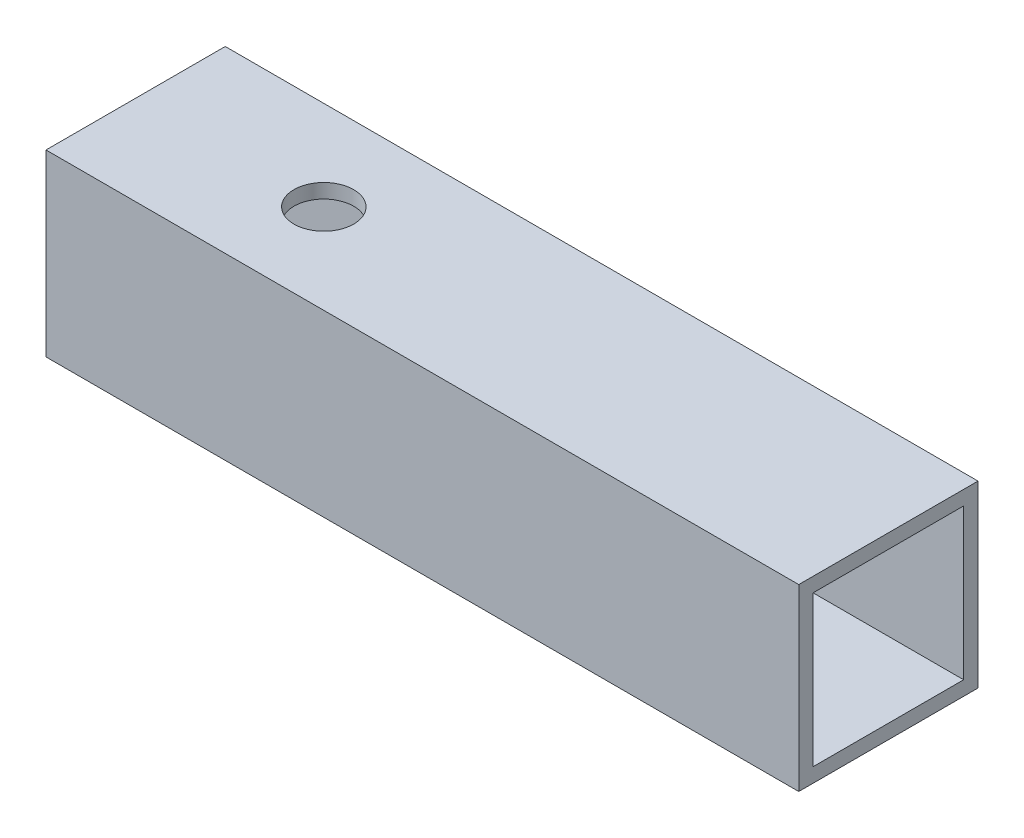
ISO-10303-21;
HEADER;
FILE_DESCRIPTION(('STEP AP214'),'2;1');
FILE_NAME('part.step','',(''),(''),'','','');
FILE_SCHEMA(('AUTOMOTIVE_DESIGN { 1 0 10303 214 1 1 1 1 }'));
ENDSEC;
DATA;
#1=APPLICATION_CONTEXT('core data for automotive mechanical design processes');
#2=APPLICATION_PROTOCOL_DEFINITION('international standard','automotive_design',2000,#1);
#3=PRODUCT_CONTEXT('',#1,'mechanical');
#4=PRODUCT('Part','Part','',(#3));
#5=PRODUCT_RELATED_PRODUCT_CATEGORY('part','',(#4));
#6=PRODUCT_DEFINITION_FORMATION('','',#4);
#7=PRODUCT_DEFINITION_CONTEXT('part definition',#1,'design');
#8=PRODUCT_DEFINITION('design','',#6,#7);
#9=PRODUCT_DEFINITION_SHAPE('','',#8);
#10=(LENGTH_UNIT() NAMED_UNIT(*) SI_UNIT(.MILLI.,.METRE.));
#11=(NAMED_UNIT(*) PLANE_ANGLE_UNIT() SI_UNIT($,.RADIAN.));
#12=(NAMED_UNIT(*) SI_UNIT($,.STERADIAN.) SOLID_ANGLE_UNIT());
#13=UNCERTAINTY_MEASURE_WITH_UNIT(LENGTH_MEASURE(1.E-05),#10,'distance_accuracy_value','');
#14=(GEOMETRIC_REPRESENTATION_CONTEXT(3) GLOBAL_UNCERTAINTY_ASSIGNED_CONTEXT((#13)) GLOBAL_UNIT_ASSIGNED_CONTEXT((#10,
#11,#12)) REPRESENTATION_CONTEXT('',''));
#15=CARTESIAN_POINT('',(0.,0.,0.));
#16=DIRECTION('',(0.,0.,1.));
#17=DIRECTION('',(1.,0.,0.));
#18=AXIS2_PLACEMENT_3D('',#15,#16,#17);
#19=CARTESIAN_POINT('',(20.,2.38125,-2.38125));
#20=DIRECTION('',(0.,0.,1.));
#21=DIRECTION('',(0.,-1.,0.));
#22=AXIS2_PLACEMENT_3D('',#19,#20,#21);
#23=PLANE('',#22);
#24=DIRECTION('',(0.,1.,0.));
#25=VECTOR('',#24,1.);
#26=CARTESIAN_POINT('',(0.,2.38125,-2.38125));
#27=LINE('',#26,#25);
#28=CARTESIAN_POINT('',(0.,-2.38125,-2.38125));
#29=VERTEX_POINT('',#28);
#30=CARTESIAN_POINT('',(0.,2.38125,-2.38125));
#31=VERTEX_POINT('',#30);
#32=EDGE_CURVE('E137',#29,#31,#27,.T.);
#33=ORIENTED_EDGE('',*,*,#32,.T.);
#34=DIRECTION('',(-1.,0.,0.));
#35=VECTOR('',#34,1.);
#36=CARTESIAN_POINT('',(20.,2.38125,-2.38125));
#37=LINE('',#36,#35);
#38=CARTESIAN_POINT('',(20.,2.38125,-2.38125));
#39=VERTEX_POINT('',#38);
#40=EDGE_CURVE('E11',#39,#31,#37,.T.);
#41=ORIENTED_EDGE('',*,*,#40,.F.);
#42=DIRECTION('',(0.,1.,0.));
#43=VECTOR('',#42,1.);
#44=CARTESIAN_POINT('',(20.,2.38125,-2.38125));
#45=LINE('',#44,#43);
#46=CARTESIAN_POINT('',(20.,-2.38125,-2.38125));
#47=VERTEX_POINT('',#46);
#48=EDGE_CURVE('E141',#47,#39,#45,.T.);
#49=ORIENTED_EDGE('',*,*,#48,.F.);
#50=DIRECTION('',(-1.,0.,0.));
#51=VECTOR('',#50,1.);
#52=CARTESIAN_POINT('',(20.,-2.38125,-2.38125));
#53=LINE('',#52,#51);
#54=EDGE_CURVE('E151',#47,#29,#53,.T.);
#55=ORIENTED_EDGE('',*,*,#54,.T.);
#56=EDGE_LOOP('',(#33,#41,#49,#55));
#57=FACE_BOUND('',#56,.T.);
#58=ADVANCED_FACE('F36',(#57),#23,.F.);
#59=CARTESIAN_POINT('',(20.,2.38125,2.38125));
#60=DIRECTION('',(0.,-1.,0.));
#61=DIRECTION('',(0.,0.,-1.));
#62=AXIS2_PLACEMENT_3D('',#59,#60,#61);
#63=PLANE('',#62);
#64=CARTESIAN_POINT('',(5.,2.38125,0.));
#65=DIRECTION('',(0.,1.,0.));
#66=DIRECTION('',(0.,0.,1.));
#67=AXIS2_PLACEMENT_3D('',#64,#65,#66);
#68=CIRCLE('',#67,0.793749999999999);
#69=CARTESIAN_POINT('',(5.,2.38125,0.793749999999999));
#70=VERTEX_POINT('',#69);
#71=EDGE_CURVE('E228',#70,#70,#68,.T.);
#72=ORIENTED_EDGE('',*,*,#71,.F.);
#73=EDGE_LOOP('',(#72));
#74=FACE_BOUND('',#73,.T.);
#75=DIRECTION('',(0.,0.,1.));
#76=VECTOR('',#75,1.);
#77=CARTESIAN_POINT('',(0.,2.38125,2.38125));
#78=LINE('',#77,#76);
#79=CARTESIAN_POINT('',(0.,2.38125,2.38125));
#80=VERTEX_POINT('',#79);
#81=EDGE_CURVE('E154',#31,#80,#78,.T.);
#82=ORIENTED_EDGE('',*,*,#81,.T.);
#83=DIRECTION('',(-1.,0.,0.));
#84=VECTOR('',#83,1.);
#85=CARTESIAN_POINT('',(20.,2.38125,2.38125));
#86=LINE('',#85,#84);
#87=CARTESIAN_POINT('',(20.,2.38125,2.38125));
#88=VERTEX_POINT('',#87);
#89=EDGE_CURVE('E44',#88,#80,#86,.T.);
#90=ORIENTED_EDGE('',*,*,#89,.F.);
#91=DIRECTION('',(0.,0.,1.));
#92=VECTOR('',#91,1.);
#93=CARTESIAN_POINT('',(20.,2.38125,2.38125));
#94=LINE('',#93,#92);
#95=EDGE_CURVE('E144',#39,#88,#94,.T.);
#96=ORIENTED_EDGE('',*,*,#95,.F.);
#97=ORIENTED_EDGE('',*,*,#40,.T.);
#98=EDGE_LOOP('',(#82,#90,#96,#97));
#99=FACE_BOUND('',#98,.T.);
#100=ADVANCED_FACE('F183',(#74,#99),#63,.F.);
#101=CARTESIAN_POINT('',(20.,2.38125,2.38125));
#102=DIRECTION('',(0.,0.,-1.));
#103=DIRECTION('',(0.,1.,0.));
#104=AXIS2_PLACEMENT_3D('',#101,#102,#103);
#105=PLANE('',#104);
#106=DIRECTION('',(0.,-1.,0.));
#107=VECTOR('',#106,1.);
#108=CARTESIAN_POINT('',(0.,2.38125,2.38125));
#109=LINE('',#108,#107);
#110=CARTESIAN_POINT('',(0.,-2.38125,2.38125));
#111=VERTEX_POINT('',#110);
#112=EDGE_CURVE('E156',#80,#111,#109,.T.);
#113=ORIENTED_EDGE('',*,*,#112,.T.);
#114=DIRECTION('',(-1.,0.,0.));
#115=VECTOR('',#114,1.);
#116=CARTESIAN_POINT('',(20.,-2.38125,2.38125));
#117=LINE('',#116,#115);
#118=CARTESIAN_POINT('',(20.,-2.38125,2.38125));
#119=VERTEX_POINT('',#118);
#120=EDGE_CURVE('E161',#119,#111,#117,.T.);
#121=ORIENTED_EDGE('',*,*,#120,.F.);
#122=DIRECTION('',(0.,-1.,0.));
#123=VECTOR('',#122,1.);
#124=CARTESIAN_POINT('',(20.,2.38125,2.38125));
#125=LINE('',#124,#123);
#126=EDGE_CURVE('E147',#88,#119,#125,.T.);
#127=ORIENTED_EDGE('',*,*,#126,.F.);
#128=ORIENTED_EDGE('',*,*,#89,.T.);
#129=EDGE_LOOP('',(#113,#121,#127,#128));
#130=FACE_BOUND('',#129,.T.);
#131=ADVANCED_FACE('F169',(#130),#105,.F.);
#132=CARTESIAN_POINT('',(20.,-2.38125,2.38125));
#133=DIRECTION('',(0.,1.,0.));
#134=DIRECTION('',(0.,0.,1.));
#135=AXIS2_PLACEMENT_3D('',#132,#133,#134);
#136=PLANE('',#135);
#137=CARTESIAN_POINT('',(5.,-2.38125,0.));
#138=DIRECTION('',(0.,1.,0.));
#139=DIRECTION('',(0.,0.,1.));
#140=AXIS2_PLACEMENT_3D('',#137,#138,#139);
#141=CIRCLE('',#140,0.793749999999999);
#142=CARTESIAN_POINT('',(5.,-2.38125,0.793749999999999));
#143=VERTEX_POINT('',#142);
#144=EDGE_CURVE('E125',#143,#143,#141,.T.);
#145=ORIENTED_EDGE('',*,*,#144,.T.);
#146=EDGE_LOOP('',(#145));
#147=FACE_BOUND('',#146,.T.);
#148=DIRECTION('',(0.,0.,-1.));
#149=VECTOR('',#148,1.);
#150=CARTESIAN_POINT('',(0.,-2.38125,2.38125));
#151=LINE('',#150,#149);
#152=EDGE_CURVE('E145',#111,#29,#151,.T.);
#153=ORIENTED_EDGE('',*,*,#152,.T.);
#154=ORIENTED_EDGE('',*,*,#54,.F.);
#155=DIRECTION('',(0.,0.,-1.));
#156=VECTOR('',#155,1.);
#157=CARTESIAN_POINT('',(20.,-2.38125,2.38125));
#158=LINE('',#157,#156);
#159=EDGE_CURVE('E149',#119,#47,#158,.T.);
#160=ORIENTED_EDGE('',*,*,#159,.F.);
#161=ORIENTED_EDGE('',*,*,#120,.T.);
#162=EDGE_LOOP('',(#153,#154,#160,#161));
#163=FACE_BOUND('',#162,.T.);
#164=ADVANCED_FACE('F178',(#147,#163),#136,.F.);
#165=CARTESIAN_POINT('',(20.,0.,0.));
#166=DIRECTION('',(1.,0.,0.));
#167=DIRECTION('',(0.,0.,-1.));
#168=AXIS2_PLACEMENT_3D('',#165,#166,#167);
#169=PLANE('',#168);
#170=DIRECTION('',(0.,1.,0.));
#171=VECTOR('',#170,1.);
#172=CARTESIAN_POINT('',(20.,2.,2.));
#173=LINE('',#172,#171);
#174=CARTESIAN_POINT('',(20.,-2.,2.));
#175=VERTEX_POINT('',#174);
#176=CARTESIAN_POINT('',(20.,2.,2.));
#177=VERTEX_POINT('',#176);
#178=EDGE_CURVE('E103',#175,#177,#173,.T.);
#179=ORIENTED_EDGE('',*,*,#178,.T.);
#180=DIRECTION('',(0.,0.,-1.));
#181=VECTOR('',#180,1.);
#182=CARTESIAN_POINT('',(20.,2.,-2.));
#183=LINE('',#182,#181);
#184=CARTESIAN_POINT('',(20.,2.,-2.));
#185=VERTEX_POINT('',#184);
#186=EDGE_CURVE('E112',#177,#185,#183,.T.);
#187=ORIENTED_EDGE('',*,*,#186,.T.);
#188=DIRECTION('',(0.,-1.,0.));
#189=VECTOR('',#188,1.);
#190=CARTESIAN_POINT('',(20.,2.,-2.));
#191=LINE('',#190,#189);
#192=CARTESIAN_POINT('',(20.,-2.,-2.));
#193=VERTEX_POINT('',#192);
#194=EDGE_CURVE('E51',#185,#193,#191,.T.);
#195=ORIENTED_EDGE('',*,*,#194,.T.);
#196=DIRECTION('',(0.,0.,1.));
#197=VECTOR('',#196,1.);
#198=CARTESIAN_POINT('',(20.,-2.,-2.));
#199=LINE('',#198,#197);
#200=EDGE_CURVE('E109',#193,#175,#199,.T.);
#201=ORIENTED_EDGE('',*,*,#200,.T.);
#202=EDGE_LOOP('',(#179,#187,#195,#201));
#203=FACE_BOUND('',#202,.T.);
#204=ORIENTED_EDGE('',*,*,#48,.T.);
#205=ORIENTED_EDGE('',*,*,#95,.T.);
#206=ORIENTED_EDGE('',*,*,#126,.T.);
#207=ORIENTED_EDGE('',*,*,#159,.T.);
#208=EDGE_LOOP('',(#204,#205,#206,#207));
#209=FACE_BOUND('',#208,.T.);
#210=ADVANCED_FACE('F116',(#203,#209),#169,.T.);
#211=CARTESIAN_POINT('',(0.,0.,0.));
#212=DIRECTION('',(1.,0.,0.));
#213=DIRECTION('',(0.,0.,-1.));
#214=AXIS2_PLACEMENT_3D('',#211,#212,#213);
#215=PLANE('',#214);
#216=DIRECTION('',(0.,0.,-1.));
#217=VECTOR('',#216,1.);
#218=CARTESIAN_POINT('',(0.,2.,-2.));
#219=LINE('',#218,#217);
#220=CARTESIAN_POINT('',(0.,2.,2.));
#221=VERTEX_POINT('',#220);
#222=CARTESIAN_POINT('',(0.,2.,-2.));
#223=VERTEX_POINT('',#222);
#224=EDGE_CURVE('E131',#221,#223,#219,.T.);
#225=ORIENTED_EDGE('',*,*,#224,.F.);
#226=DIRECTION('',(0.,1.,0.));
#227=VECTOR('',#226,1.);
#228=CARTESIAN_POINT('',(0.,2.,2.));
#229=LINE('',#228,#227);
#230=CARTESIAN_POINT('',(0.,-2.,2.));
#231=VERTEX_POINT('',#230);
#232=EDGE_CURVE('E59',#231,#221,#229,.T.);
#233=ORIENTED_EDGE('',*,*,#232,.F.);
#234=DIRECTION('',(0.,0.,1.));
#235=VECTOR('',#234,1.);
#236=CARTESIAN_POINT('',(0.,-2.,-2.));
#237=LINE('',#236,#235);
#238=CARTESIAN_POINT('',(0.,-2.,-2.));
#239=VERTEX_POINT('',#238);
#240=EDGE_CURVE('E119',#239,#231,#237,.T.);
#241=ORIENTED_EDGE('',*,*,#240,.F.);
#242=DIRECTION('',(0.,-1.,0.));
#243=VECTOR('',#242,1.);
#244=CARTESIAN_POINT('',(0.,2.,-2.));
#245=LINE('',#244,#243);
#246=EDGE_CURVE('E122',#223,#239,#245,.T.);
#247=ORIENTED_EDGE('',*,*,#246,.F.);
#248=EDGE_LOOP('',(#225,#233,#241,#247));
#249=FACE_BOUND('',#248,.T.);
#250=ORIENTED_EDGE('',*,*,#32,.F.);
#251=ORIENTED_EDGE('',*,*,#152,.F.);
#252=ORIENTED_EDGE('',*,*,#112,.F.);
#253=ORIENTED_EDGE('',*,*,#81,.F.);
#254=EDGE_LOOP('',(#250,#251,#252,#253));
#255=FACE_BOUND('',#254,.T.);
#256=ADVANCED_FACE('F175',(#249,#255),#215,.F.);
#257=CARTESIAN_POINT('',(20.,2.,2.));
#258=DIRECTION('',(0.,0.,1.));
#259=DIRECTION('',(0.,-1.,0.));
#260=AXIS2_PLACEMENT_3D('',#257,#258,#259);
#261=PLANE('',#260);
#262=ORIENTED_EDGE('',*,*,#232,.T.);
#263=DIRECTION('',(-1.,0.,0.));
#264=VECTOR('',#263,1.);
#265=CARTESIAN_POINT('',(20.,2.,2.));
#266=LINE('',#265,#264);
#267=EDGE_CURVE('E99',#177,#221,#266,.T.);
#268=ORIENTED_EDGE('',*,*,#267,.F.);
#269=ORIENTED_EDGE('',*,*,#178,.F.);
#270=DIRECTION('',(-1.,0.,0.));
#271=VECTOR('',#270,1.);
#272=CARTESIAN_POINT('',(20.,-2.,2.));
#273=LINE('',#272,#271);
#274=EDGE_CURVE('E135',#175,#231,#273,.T.);
#275=ORIENTED_EDGE('',*,*,#274,.T.);
#276=EDGE_LOOP('',(#262,#268,#269,#275));
#277=FACE_BOUND('',#276,.T.);
#278=ADVANCED_FACE('F101',(#277),#261,.F.);
#279=CARTESIAN_POINT('',(20.,-2.,-2.));
#280=DIRECTION('',(0.,-1.,0.));
#281=DIRECTION('',(0.,0.,-1.));
#282=AXIS2_PLACEMENT_3D('',#279,#280,#281);
#283=PLANE('',#282);
#284=CARTESIAN_POINT('',(5.,-2.,0.));
#285=DIRECTION('',(0.,-1.,0.));
#286=DIRECTION('',(0.,0.,-1.));
#287=AXIS2_PLACEMENT_3D('',#284,#285,#286);
#288=CIRCLE('',#287,0.793749999999999);
#289=CARTESIAN_POINT('',(5.,-2.,-0.793749999999999));
#290=VERTEX_POINT('',#289);
#291=EDGE_CURVE('E224',#290,#290,#288,.T.);
#292=ORIENTED_EDGE('',*,*,#291,.T.);
#293=EDGE_LOOP('',(#292));
#294=FACE_BOUND('',#293,.T.);
#295=ORIENTED_EDGE('',*,*,#240,.T.);
#296=ORIENTED_EDGE('',*,*,#274,.F.);
#297=ORIENTED_EDGE('',*,*,#200,.F.);
#298=DIRECTION('',(-1.,0.,0.));
#299=VECTOR('',#298,1.);
#300=CARTESIAN_POINT('',(20.,-2.,-2.));
#301=LINE('',#300,#299);
#302=EDGE_CURVE('E138',#193,#239,#301,.T.);
#303=ORIENTED_EDGE('',*,*,#302,.T.);
#304=EDGE_LOOP('',(#295,#296,#297,#303));
#305=FACE_BOUND('',#304,.T.);
#306=ADVANCED_FACE('F203',(#294,#305),#283,.F.);
#307=CARTESIAN_POINT('',(20.,2.,-2.));
#308=DIRECTION('',(0.,0.,-1.));
#309=DIRECTION('',(0.,1.,0.));
#310=AXIS2_PLACEMENT_3D('',#307,#308,#309);
#311=PLANE('',#310);
#312=ORIENTED_EDGE('',*,*,#246,.T.);
#313=ORIENTED_EDGE('',*,*,#302,.F.);
#314=ORIENTED_EDGE('',*,*,#194,.F.);
#315=DIRECTION('',(-1.,0.,0.));
#316=VECTOR('',#315,1.);
#317=CARTESIAN_POINT('',(20.,2.,-2.));
#318=LINE('',#317,#316);
#319=EDGE_CURVE('E108',#185,#223,#318,.T.);
#320=ORIENTED_EDGE('',*,*,#319,.T.);
#321=EDGE_LOOP('',(#312,#313,#314,#320));
#322=FACE_BOUND('',#321,.T.);
#323=ADVANCED_FACE('F207',(#322),#311,.F.);
#324=CARTESIAN_POINT('',(20.,2.,-2.));
#325=DIRECTION('',(0.,1.,0.));
#326=DIRECTION('',(0.,0.,1.));
#327=AXIS2_PLACEMENT_3D('',#324,#325,#326);
#328=PLANE('',#327);
#329=CARTESIAN_POINT('',(5.,2.,0.));
#330=DIRECTION('',(0.,1.,0.));
#331=DIRECTION('',(0.,0.,1.));
#332=AXIS2_PLACEMENT_3D('',#329,#330,#331);
#333=CIRCLE('',#332,0.793749999999999);
#334=CARTESIAN_POINT('',(5.,2.,0.793749999999999));
#335=VERTEX_POINT('',#334);
#336=EDGE_CURVE('E39',#335,#335,#333,.T.);
#337=ORIENTED_EDGE('',*,*,#336,.T.);
#338=EDGE_LOOP('',(#337));
#339=FACE_BOUND('',#338,.T.);
#340=ORIENTED_EDGE('',*,*,#224,.T.);
#341=ORIENTED_EDGE('',*,*,#319,.F.);
#342=ORIENTED_EDGE('',*,*,#186,.F.);
#343=ORIENTED_EDGE('',*,*,#267,.T.);
#344=EDGE_LOOP('',(#340,#341,#342,#343));
#345=FACE_BOUND('',#344,.T.);
#346=ADVANCED_FACE('F113',(#339,#345),#328,.F.);
#347=CARTESIAN_POINT('',(5.,-7.61875,0.));
#348=DIRECTION('',(0.,1.,0.));
#349=DIRECTION('',(0.,0.,1.));
#350=AXIS2_PLACEMENT_3D('',#347,#348,#349);
#351=CYLINDRICAL_SURFACE('',#350,0.793749999999999);
#352=ORIENTED_EDGE('',*,*,#71,.T.);
#353=EDGE_LOOP('',(#352));
#354=FACE_BOUND('',#353,.T.);
#355=ORIENTED_EDGE('',*,*,#336,.F.);
#356=EDGE_LOOP('',(#355));
#357=FACE_BOUND('',#356,.T.);
#358=ADVANCED_FACE('F206',(#354,#357),#351,.F.);
#359=ORIENTED_EDGE('',*,*,#291,.F.);
#360=EDGE_LOOP('',(#359));
#361=FACE_BOUND('',#360,.T.);
#362=ORIENTED_EDGE('',*,*,#144,.F.);
#363=EDGE_LOOP('',(#362));
#364=FACE_BOUND('',#363,.T.);
#365=ADVANCED_FACE('F214',(#361,#364),#351,.F.);
#366=CLOSED_SHELL('',(#58,#100,#131,#164,#210,#256,#278,#306,#323,#346,#358,#365));
#367=MANIFOLD_SOLID_BREP('B2',#366);
#368=ADVANCED_BREP_SHAPE_REPRESENTATION('',(#18,#367),#14);
#369=SHAPE_DEFINITION_REPRESENTATION(#9,#368);
ENDSEC;
END-ISO-10303-21;
